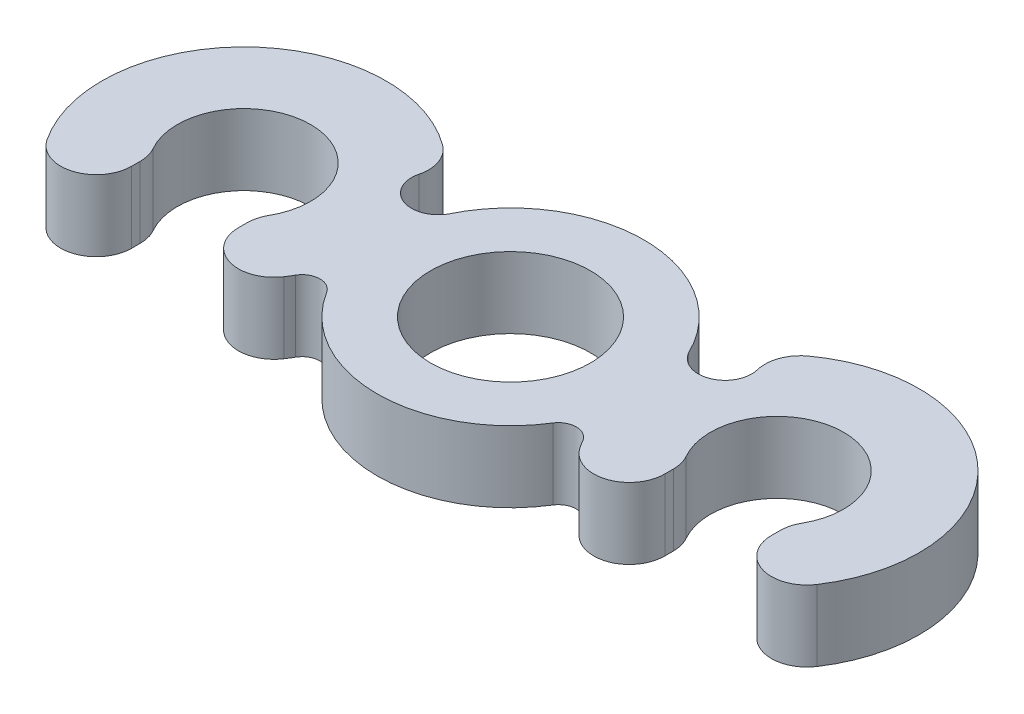
ISO-10303-21;
HEADER;
FILE_DESCRIPTION(('STEP AP214'),'2;1');
FILE_NAME('part.step','',(''),(''),'','','');
FILE_SCHEMA(('AUTOMOTIVE_DESIGN { 1 0 10303 214 1 1 1 1 }'));
ENDSEC;
DATA;
#1=APPLICATION_CONTEXT('core data for automotive mechanical design processes');
#2=APPLICATION_PROTOCOL_DEFINITION('international standard','automotive_design',2000,#1);
#3=PRODUCT_CONTEXT('',#1,'mechanical');
#4=PRODUCT('Part','Part','',(#3));
#5=PRODUCT_RELATED_PRODUCT_CATEGORY('part','',(#4));
#6=PRODUCT_DEFINITION_FORMATION('','',#4);
#7=PRODUCT_DEFINITION_CONTEXT('part definition',#1,'design');
#8=PRODUCT_DEFINITION('design','',#6,#7);
#9=PRODUCT_DEFINITION_SHAPE('','',#8);
#10=(LENGTH_UNIT() NAMED_UNIT(*) SI_UNIT(.MILLI.,.METRE.));
#11=(NAMED_UNIT(*) PLANE_ANGLE_UNIT() SI_UNIT($,.RADIAN.));
#12=(NAMED_UNIT(*) SI_UNIT($,.STERADIAN.) SOLID_ANGLE_UNIT());
#13=UNCERTAINTY_MEASURE_WITH_UNIT(LENGTH_MEASURE(1.E-05),#10,'distance_accuracy_value','');
#14=(GEOMETRIC_REPRESENTATION_CONTEXT(3) GLOBAL_UNCERTAINTY_ASSIGNED_CONTEXT((#13)) GLOBAL_UNIT_ASSIGNED_CONTEXT((#10,
#11,#12)) REPRESENTATION_CONTEXT('',''));
#15=CARTESIAN_POINT('',(0.,0.,0.));
#16=DIRECTION('',(0.,0.,1.));
#17=DIRECTION('',(1.,0.,0.));
#18=AXIS2_PLACEMENT_3D('',#15,#16,#17);
#19=CARTESIAN_POINT('',(-15.,2.,0.));
#20=DIRECTION('',(0.,-1.,0.));
#21=DIRECTION('',(0.,0.,-1.));
#22=AXIS2_PLACEMENT_3D('',#19,#20,#21);
#23=CYLINDRICAL_SURFACE('',#22,8.);
#24=CARTESIAN_POINT('',(-15.,-2.,0.));
#25=DIRECTION('',(0.,1.,0.));
#26=DIRECTION('',(0.,0.,1.));
#27=AXIS2_PLACEMENT_3D('',#24,#25,#26);
#28=CIRCLE('',#27,8.);
#29=CARTESIAN_POINT('',(-8.33333333333333,-2.,4.42216638714053));
#30=VERTEX_POINT('',#29);
#31=CARTESIAN_POINT('',(-8.0783809474824,-2.,4.01138251626859));
#32=VERTEX_POINT('',#31);
#33=EDGE_CURVE('E341',#30,#32,#28,.T.);
#34=ORIENTED_EDGE('',*,*,#33,.T.);
#35=DIRECTION('',(0.,-1.,0.));
#36=VECTOR('',#35,1.);
#37=CARTESIAN_POINT('',(-8.0783809474824,2.,4.01138251626859));
#38=LINE('',#37,#36);
#39=CARTESIAN_POINT('',(-8.0783809474824,2.,4.01138251626859));
#40=VERTEX_POINT('',#39);
#41=EDGE_CURVE('E413',#32,#40,#38,.F.);
#42=ORIENTED_EDGE('',*,*,#41,.T.);
#43=CARTESIAN_POINT('',(-15.,2.,0.));
#44=DIRECTION('',(0.,1.,0.));
#45=DIRECTION('',(0.,0.,1.));
#46=AXIS2_PLACEMENT_3D('',#43,#44,#45);
#47=CIRCLE('',#46,8.);
#48=CARTESIAN_POINT('',(-8.33333333333333,2.,4.42216638714053));
#49=VERTEX_POINT('',#48);
#50=EDGE_CURVE('E348',#49,#40,#47,.T.);
#51=ORIENTED_EDGE('',*,*,#50,.F.);
#52=DIRECTION('',(0.,-1.,0.));
#53=VECTOR('',#52,1.);
#54=CARTESIAN_POINT('',(-8.33333333333333,2.,4.42216638714053));
#55=LINE('',#54,#53);
#56=EDGE_CURVE('E385',#49,#30,#55,.T.);
#57=ORIENTED_EDGE('',*,*,#56,.T.);
#58=EDGE_LOOP('',(#34,#42,#51,#57));
#59=FACE_BOUND('',#58,.T.);
#60=ADVANCED_FACE('F35',(#59),#23,.T.);
#61=CARTESIAN_POINT('',(-15.,2.,0.));
#62=DIRECTION('',(0.,1.,0.));
#63=DIRECTION('',(0.,0.,1.));
#64=AXIS2_PLACEMENT_3D('',#61,#62,#63);
#65=PLANE('',#64);
#66=CARTESIAN_POINT('',(0.,2.,0.));
#67=DIRECTION('',(0.,1.,0.));
#68=DIRECTION('',(0.,0.,1.));
#69=AXIS2_PLACEMENT_3D('',#66,#67,#68);
#70=CIRCLE('',#69,4.5);
#71=CARTESIAN_POINT('',(0.,2.,4.5));
#72=VERTEX_POINT('',#71);
#73=EDGE_CURVE('E495',#72,#72,#70,.T.);
#74=ORIENTED_EDGE('',*,*,#73,.F.);
#75=EDGE_LOOP('',(#74));
#76=FACE_BOUND('',#75,.T.);
#77=ORIENTED_EDGE('',*,*,#50,.T.);
#78=CARTESIAN_POINT('',(-7.2131785659177,2.,4.51280533080217));
#79=DIRECTION('',(0.,1.,0.));
#80=DIRECTION('',(0.,0.,1.));
#81=AXIS2_PLACEMENT_3D('',#78,#79,#80);
#82=CIRCLE('',#81,1.);
#83=CARTESIAN_POINT('',(-6.3654216790065,2.,3.9824203190469));
#84=VERTEX_POINT('',#83);
#85=EDGE_CURVE('E43',#40,#84,#82,.F.);
#86=ORIENTED_EDGE('',*,*,#85,.T.);
#87=CARTESIAN_POINT('',(0.,2.,0.));
#88=DIRECTION('',(0.,1.,0.));
#89=DIRECTION('',(0.,0.,1.));
#90=AXIS2_PLACEMENT_3D('',#87,#88,#89);
#91=CIRCLE('',#90,7.50854611420371);
#92=CARTESIAN_POINT('',(6.3654216790065,2.,3.9824203190469));
#93=VERTEX_POINT('',#92);
#94=EDGE_CURVE('E423',#84,#93,#91,.T.);
#95=ORIENTED_EDGE('',*,*,#94,.T.);
#96=CARTESIAN_POINT('',(7.2131785659177,2.,4.51280533080217));
#97=DIRECTION('',(0.,1.,0.));
#98=DIRECTION('',(0.,0.,1.));
#99=AXIS2_PLACEMENT_3D('',#96,#97,#98);
#100=CIRCLE('',#99,1.);
#101=CARTESIAN_POINT('',(8.0783809474824,2.,4.01138251626859));
#102=VERTEX_POINT('',#101);
#103=EDGE_CURVE('E417',#93,#102,#100,.F.);
#104=ORIENTED_EDGE('',*,*,#103,.T.);
#105=CARTESIAN_POINT('',(15.,2.,0.));
#106=DIRECTION('',(0.,-1.,0.));
#107=DIRECTION('',(0.,0.,1.));
#108=AXIS2_PLACEMENT_3D('',#105,#106,#107);
#109=CIRCLE('',#108,8.);
#110=CARTESIAN_POINT('',(8.33333333333333,2.,4.42216638714053));
#111=VERTEX_POINT('',#110);
#112=EDGE_CURVE('E274',#111,#102,#109,.T.);
#113=ORIENTED_EDGE('',*,*,#112,.F.);
#114=CARTESIAN_POINT('',(10.,2.,3.3166247903554));
#115=DIRECTION('',(0.,-1.,0.));
#116=DIRECTION('',(0.,0.,1.));
#117=AXIS2_PLACEMENT_3D('',#114,#115,#116);
#118=CIRCLE('',#117,2.);
#119=CARTESIAN_POINT('',(12.,2.,3.3166247903554));
#120=VERTEX_POINT('',#119);
#121=EDGE_CURVE('E315',#120,#111,#118,.T.);
#122=ORIENTED_EDGE('',*,*,#121,.F.);
#123=DIRECTION('',(0.,0.,-1.));
#124=VECTOR('',#123,1.);
#125=CARTESIAN_POINT('',(12.,2.,0.));
#126=LINE('',#125,#124);
#127=CARTESIAN_POINT('',(12.,2.,2.83945417290014));
#128=VERTEX_POINT('',#127);
#129=EDGE_CURVE('E249',#120,#128,#126,.T.);
#130=ORIENTED_EDGE('',*,*,#129,.T.);
#131=CARTESIAN_POINT('',(10.,2.,2.83945417290014));
#132=DIRECTION('',(0.,-1.,0.));
#133=DIRECTION('',(0.,0.,1.));
#134=AXIS2_PLACEMENT_3D('',#131,#132,#133);
#135=CIRCLE('',#134,2.);
#136=CARTESIAN_POINT('',(11.7391304347826,2.,1.85181793884791));
#137=VERTEX_POINT('',#136);
#138=EDGE_CURVE('E281',#137,#128,#135,.T.);
#139=ORIENTED_EDGE('',*,*,#138,.F.);
#140=CARTESIAN_POINT('',(15.,2.,0.));
#141=DIRECTION('',(0.,-1.,0.));
#142=DIRECTION('',(0.,0.,1.));
#143=AXIS2_PLACEMENT_3D('',#140,#141,#142);
#144=CIRCLE('',#143,3.75);
#145=CARTESIAN_POINT('',(18.2608695652174,2.,1.85181793884791));
#146=VERTEX_POINT('',#145);
#147=EDGE_CURVE('E267',#137,#146,#144,.T.);
#148=ORIENTED_EDGE('',*,*,#147,.T.);
#149=CARTESIAN_POINT('',(20.,2.,2.83945417290013));
#150=DIRECTION('',(0.,-1.,0.));
#151=DIRECTION('',(0.,0.,1.));
#152=AXIS2_PLACEMENT_3D('',#149,#150,#151);
#153=CIRCLE('',#152,2.);
#154=CARTESIAN_POINT('',(18.,2.,2.83945417290013));
#155=VERTEX_POINT('',#154);
#156=EDGE_CURVE('E284',#155,#146,#153,.T.);
#157=ORIENTED_EDGE('',*,*,#156,.F.);
#158=DIRECTION('',(0.,0.,1.));
#159=VECTOR('',#158,1.);
#160=CARTESIAN_POINT('',(18.,2.,0.));
#161=LINE('',#160,#159);
#162=CARTESIAN_POINT('',(18.,2.,3.3166247903554));
#163=VERTEX_POINT('',#162);
#164=EDGE_CURVE('E227',#155,#163,#161,.T.);
#165=ORIENTED_EDGE('',*,*,#164,.T.);
#166=CARTESIAN_POINT('',(20.,2.,3.3166247903554));
#167=DIRECTION('',(0.,-1.,0.));
#168=DIRECTION('',(0.,0.,1.));
#169=AXIS2_PLACEMENT_3D('',#166,#167,#168);
#170=CIRCLE('',#169,2.);
#171=CARTESIAN_POINT('',(21.6666666666667,2.,4.42216638714053));
#172=VERTEX_POINT('',#171);
#173=EDGE_CURVE('E312',#172,#163,#170,.T.);
#174=ORIENTED_EDGE('',*,*,#173,.F.);
#175=CARTESIAN_POINT('',(10.2894826538785,2.,-6.466144626583));
#176=VERTEX_POINT('',#175);
#177=EDGE_CURVE('E232',#176,#172,#109,.T.);
#178=ORIENTED_EDGE('',*,*,#177,.F.);
#179=CARTESIAN_POINT('',(11.4671119904088,2.,-4.84960846993725));
#180=DIRECTION('',(0.,-1.,0.));
#181=DIRECTION('',(0.,0.,1.));
#182=AXIS2_PLACEMENT_3D('',#179,#180,#181);
#183=CIRCLE('',#182,2.);
#184=CARTESIAN_POINT('',(9.5269318643035,2.,-4.36411791568739));
#185=VERTEX_POINT('',#184);
#186=EDGE_CURVE('E231',#185,#176,#183,.T.);
#187=ORIENTED_EDGE('',*,*,#186,.F.);
#188=CARTESIAN_POINT('',(8.07179676972449,2.,-4.));
#189=DIRECTION('',(0.,-1.,0.));
#190=DIRECTION('',(0.,0.,1.));
#191=AXIS2_PLACEMENT_3D('',#188,#189,#190);
#192=CIRCLE('',#191,1.5);
#193=CARTESIAN_POINT('',(6.84081905975206,2.,-3.14285714285714));
#194=VERTEX_POINT('',#193);
#195=EDGE_CURVE('E252',#185,#194,#192,.T.);
#196=ORIENTED_EDGE('',*,*,#195,.T.);
#197=CARTESIAN_POINT('',(5.19951544645548,2.,-2.));
#198=DIRECTION('',(0.,-1.,0.));
#199=DIRECTION('',(0.,0.,1.));
#200=AXIS2_PLACEMENT_3D('',#197,#198,#199);
#201=CIRCLE('',#200,2.);
#202=CARTESIAN_POINT('',(6.78103889346888,2.,-3.22424817195977));
#203=VERTEX_POINT('',#202);
#204=EDGE_CURVE('E279',#203,#194,#201,.T.);
#205=ORIENTED_EDGE('',*,*,#204,.F.);
#206=CARTESIAN_POINT('',(-6.78103889346888,2.,-3.22424817195977));
#207=VERTEX_POINT('',#206);
#208=EDGE_CURVE('E430',#203,#207,#91,.T.);
#209=ORIENTED_EDGE('',*,*,#208,.T.);
#210=CARTESIAN_POINT('',(-5.19951544645548,2.,-2.));
#211=DIRECTION('',(0.,1.,0.));
#212=DIRECTION('',(0.,0.,1.));
#213=AXIS2_PLACEMENT_3D('',#210,#211,#212);
#214=CIRCLE('',#213,2.);
#215=CARTESIAN_POINT('',(-6.84081905975206,2.,-3.14285714285714));
#216=VERTEX_POINT('',#215);
#217=EDGE_CURVE('E356',#207,#216,#214,.T.);
#218=ORIENTED_EDGE('',*,*,#217,.T.);
#219=CARTESIAN_POINT('',(-8.07179676972449,2.,-4.));
#220=DIRECTION('',(0.,1.,0.));
#221=DIRECTION('',(0.,0.,1.));
#222=AXIS2_PLACEMENT_3D('',#219,#220,#221);
#223=CIRCLE('',#222,1.5);
#224=CARTESIAN_POINT('',(-9.5269318643035,2.,-4.36411791568739));
#225=VERTEX_POINT('',#224);
#226=EDGE_CURVE('E328',#225,#216,#223,.T.);
#227=ORIENTED_EDGE('',*,*,#226,.F.);
#228=CARTESIAN_POINT('',(-11.4671119904088,2.,-4.84960846993725));
#229=DIRECTION('',(0.,1.,0.));
#230=DIRECTION('',(0.,0.,1.));
#231=AXIS2_PLACEMENT_3D('',#228,#229,#230);
#232=CIRCLE('',#231,2.);
#233=CARTESIAN_POINT('',(-10.2894826538785,2.,-6.466144626583));
#234=VERTEX_POINT('',#233);
#235=EDGE_CURVE('E354',#225,#234,#232,.T.);
#236=ORIENTED_EDGE('',*,*,#235,.T.);
#237=CARTESIAN_POINT('',(-21.6666666666667,2.,4.42216638714053));
#238=VERTEX_POINT('',#237);
#239=EDGE_CURVE('E344',#234,#238,#47,.T.);
#240=ORIENTED_EDGE('',*,*,#239,.T.);
#241=CARTESIAN_POINT('',(-20.,2.,3.3166247903554));
#242=DIRECTION('',(0.,1.,0.));
#243=DIRECTION('',(0.,0.,1.));
#244=AXIS2_PLACEMENT_3D('',#241,#242,#243);
#245=CIRCLE('',#244,2.);
#246=CARTESIAN_POINT('',(-18.,2.,3.3166247903554));
#247=VERTEX_POINT('',#246);
#248=EDGE_CURVE('E394',#238,#247,#245,.T.);
#249=ORIENTED_EDGE('',*,*,#248,.T.);
#250=DIRECTION('',(0.,0.,1.));
#251=VECTOR('',#250,1.);
#252=CARTESIAN_POINT('',(-18.,2.,0.));
#253=LINE('',#252,#251);
#254=CARTESIAN_POINT('',(-18.,2.,2.83945417290013));
#255=VERTEX_POINT('',#254);
#256=EDGE_CURVE('E321',#255,#247,#253,.T.);
#257=ORIENTED_EDGE('',*,*,#256,.F.);
#258=CARTESIAN_POINT('',(-20.,2.,2.83945417290013));
#259=DIRECTION('',(0.,1.,0.));
#260=DIRECTION('',(0.,0.,1.));
#261=AXIS2_PLACEMENT_3D('',#258,#259,#260);
#262=CIRCLE('',#261,2.);
#263=CARTESIAN_POINT('',(-18.2608695652174,2.,1.85181793884791));
#264=VERTEX_POINT('',#263);
#265=EDGE_CURVE('E361',#255,#264,#262,.T.);
#266=ORIENTED_EDGE('',*,*,#265,.T.);
#267=CARTESIAN_POINT('',(-15.,2.,0.));
#268=DIRECTION('',(0.,1.,0.));
#269=DIRECTION('',(0.,0.,1.));
#270=AXIS2_PLACEMENT_3D('',#267,#268,#269);
#271=CIRCLE('',#270,3.75);
#272=CARTESIAN_POINT('',(-11.7391304347826,2.,1.85181793884791));
#273=VERTEX_POINT('',#272);
#274=EDGE_CURVE('E338',#273,#264,#271,.T.);
#275=ORIENTED_EDGE('',*,*,#274,.F.);
#276=CARTESIAN_POINT('',(-10.,2.,2.83945417290014));
#277=DIRECTION('',(0.,1.,0.));
#278=DIRECTION('',(0.,0.,1.));
#279=AXIS2_PLACEMENT_3D('',#276,#277,#278);
#280=CIRCLE('',#279,2.);
#281=CARTESIAN_POINT('',(-12.,2.,2.83945417290014));
#282=VERTEX_POINT('',#281);
#283=EDGE_CURVE('E358',#273,#282,#280,.T.);
#284=ORIENTED_EDGE('',*,*,#283,.T.);
#285=DIRECTION('',(0.,0.,-1.));
#286=VECTOR('',#285,1.);
#287=CARTESIAN_POINT('',(-12.,2.,0.));
#288=LINE('',#287,#286);
#289=CARTESIAN_POINT('',(-12.,2.,3.3166247903554));
#290=VERTEX_POINT('',#289);
#291=EDGE_CURVE('E326',#290,#282,#288,.T.);
#292=ORIENTED_EDGE('',*,*,#291,.F.);
#293=CARTESIAN_POINT('',(-10.,2.,3.3166247903554));
#294=DIRECTION('',(0.,1.,0.));
#295=DIRECTION('',(0.,0.,1.));
#296=AXIS2_PLACEMENT_3D('',#293,#294,#295);
#297=CIRCLE('',#296,2.);
#298=EDGE_CURVE('E396',#290,#49,#297,.T.);
#299=ORIENTED_EDGE('',*,*,#298,.T.);
#300=EDGE_LOOP('',(#77,#86,#95,#104,#113,#122,#130,#139,#148,#157,#165,#174,#178,#187,#196,#205,
#209,#218,#227,#236,#240,#249,#257,#266,#275,#284,#292,#299));
#301=FACE_BOUND('',#300,.T.);
#302=ADVANCED_FACE('F422',(#76,#301),#65,.T.);
#303=CARTESIAN_POINT('',(-15.,-2.,0.));
#304=DIRECTION('',(0.,1.,0.));
#305=DIRECTION('',(0.,0.,1.));
#306=AXIS2_PLACEMENT_3D('',#303,#304,#305);
#307=PLANE('',#306);
#308=CARTESIAN_POINT('',(0.,-2.,0.));
#309=DIRECTION('',(0.,1.,0.));
#310=DIRECTION('',(0.,0.,1.));
#311=AXIS2_PLACEMENT_3D('',#308,#309,#310);
#312=CIRCLE('',#311,4.5);
#313=CARTESIAN_POINT('',(0.,-2.,4.5));
#314=VERTEX_POINT('',#313);
#315=EDGE_CURVE('E431',#314,#314,#312,.T.);
#316=ORIENTED_EDGE('',*,*,#315,.T.);
#317=EDGE_LOOP('',(#316));
#318=FACE_BOUND('',#317,.T.);
#319=CARTESIAN_POINT('',(-5.19951544645548,-2.,-2.));
#320=DIRECTION('',(0.,1.,0.));
#321=DIRECTION('',(0.,0.,1.));
#322=AXIS2_PLACEMENT_3D('',#319,#320,#321);
#323=CIRCLE('',#322,2.);
#324=CARTESIAN_POINT('',(-6.84081905975206,-2.,-3.14285714285714));
#325=VERTEX_POINT('',#324);
#326=CARTESIAN_POINT('',(-6.78103889346888,-2.,-3.22424817195977));
#327=VERTEX_POINT('',#326);
#328=EDGE_CURVE('E369',#325,#327,#323,.F.);
#329=ORIENTED_EDGE('',*,*,#328,.T.);
#330=CARTESIAN_POINT('',(0.,-2.,0.));
#331=DIRECTION('',(0.,1.,0.));
#332=DIRECTION('',(0.,0.,1.));
#333=AXIS2_PLACEMENT_3D('',#330,#331,#332);
#334=CIRCLE('',#333,7.50854611420371);
#335=CARTESIAN_POINT('',(6.78103889346888,-2.,-3.22424817195977));
#336=VERTEX_POINT('',#335);
#337=EDGE_CURVE('E488',#327,#336,#334,.F.);
#338=ORIENTED_EDGE('',*,*,#337,.T.);
#339=CARTESIAN_POINT('',(5.19951544645548,-2.,-2.));
#340=DIRECTION('',(0.,-1.,0.));
#341=DIRECTION('',(0.,0.,1.));
#342=AXIS2_PLACEMENT_3D('',#339,#340,#341);
#343=CIRCLE('',#342,2.);
#344=CARTESIAN_POINT('',(6.84081905975206,-2.,-3.14285714285714));
#345=VERTEX_POINT('',#344);
#346=EDGE_CURVE('E292',#345,#336,#343,.F.);
#347=ORIENTED_EDGE('',*,*,#346,.F.);
#348=CARTESIAN_POINT('',(8.07179676972449,-2.,-4.));
#349=DIRECTION('',(0.,-1.,0.));
#350=DIRECTION('',(0.,0.,1.));
#351=AXIS2_PLACEMENT_3D('',#348,#349,#350);
#352=CIRCLE('',#351,1.5);
#353=CARTESIAN_POINT('',(9.5269318643035,-2.,-4.36411791568739));
#354=VERTEX_POINT('',#353);
#355=EDGE_CURVE('E261',#354,#345,#352,.T.);
#356=ORIENTED_EDGE('',*,*,#355,.F.);
#357=CARTESIAN_POINT('',(11.4671119904088,-2.,-4.84960846993725));
#358=DIRECTION('',(0.,-1.,0.));
#359=DIRECTION('',(0.,0.,1.));
#360=AXIS2_PLACEMENT_3D('',#357,#358,#359);
#361=CIRCLE('',#360,2.);
#362=CARTESIAN_POINT('',(10.2894826538785,-2.,-6.466144626583));
#363=VERTEX_POINT('',#362);
#364=EDGE_CURVE('E289',#363,#354,#361,.F.);
#365=ORIENTED_EDGE('',*,*,#364,.F.);
#366=CARTESIAN_POINT('',(15.,-2.,0.));
#367=DIRECTION('',(0.,-1.,0.));
#368=DIRECTION('',(0.,0.,1.));
#369=AXIS2_PLACEMENT_3D('',#366,#367,#368);
#370=CIRCLE('',#369,8.);
#371=CARTESIAN_POINT('',(21.6666666666667,-2.,4.42216638714053));
#372=VERTEX_POINT('',#371);
#373=EDGE_CURVE('E275',#363,#372,#370,.T.);
#374=ORIENTED_EDGE('',*,*,#373,.T.);
#375=CARTESIAN_POINT('',(20.,-2.,3.3166247903554));
#376=DIRECTION('',(0.,-1.,0.));
#377=DIRECTION('',(0.,0.,1.));
#378=AXIS2_PLACEMENT_3D('',#375,#376,#377);
#379=CIRCLE('',#378,2.);
#380=CARTESIAN_POINT('',(18.,-2.,3.3166247903554));
#381=VERTEX_POINT('',#380);
#382=EDGE_CURVE('E247',#381,#372,#379,.F.);
#383=ORIENTED_EDGE('',*,*,#382,.F.);
#384=DIRECTION('',(0.,0.,1.));
#385=VECTOR('',#384,1.);
#386=CARTESIAN_POINT('',(18.,-2.,0.));
#387=LINE('',#386,#385);
#388=CARTESIAN_POINT('',(18.,-2.,2.83945417290013));
#389=VERTEX_POINT('',#388);
#390=EDGE_CURVE('E224',#389,#381,#387,.T.);
#391=ORIENTED_EDGE('',*,*,#390,.F.);
#392=CARTESIAN_POINT('',(20.,-2.,2.83945417290013));
#393=DIRECTION('',(0.,-1.,0.));
#394=DIRECTION('',(0.,0.,1.));
#395=AXIS2_PLACEMENT_3D('',#392,#393,#394);
#396=CIRCLE('',#395,2.);
#397=CARTESIAN_POINT('',(18.2608695652174,-2.,1.85181793884791));
#398=VERTEX_POINT('',#397);
#399=EDGE_CURVE('E235',#398,#389,#396,.F.);
#400=ORIENTED_EDGE('',*,*,#399,.F.);
#401=CARTESIAN_POINT('',(15.,-2.,0.));
#402=DIRECTION('',(0.,-1.,0.));
#403=DIRECTION('',(0.,0.,1.));
#404=AXIS2_PLACEMENT_3D('',#401,#402,#403);
#405=CIRCLE('',#404,3.75);
#406=CARTESIAN_POINT('',(11.7391304347826,-2.,1.85181793884791));
#407=VERTEX_POINT('',#406);
#408=EDGE_CURVE('E264',#407,#398,#405,.T.);
#409=ORIENTED_EDGE('',*,*,#408,.F.);
#410=CARTESIAN_POINT('',(10.,-2.,2.83945417290014));
#411=DIRECTION('',(0.,-1.,0.));
#412=DIRECTION('',(0.,0.,1.));
#413=AXIS2_PLACEMENT_3D('',#410,#411,#412);
#414=CIRCLE('',#413,2.);
#415=CARTESIAN_POINT('',(12.,-2.,2.83945417290014));
#416=VERTEX_POINT('',#415);
#417=EDGE_CURVE('E241',#416,#407,#414,.F.);
#418=ORIENTED_EDGE('',*,*,#417,.F.);
#419=DIRECTION('',(0.,0.,-1.));
#420=VECTOR('',#419,1.);
#421=CARTESIAN_POINT('',(12.,-2.,0.));
#422=LINE('',#421,#420);
#423=CARTESIAN_POINT('',(12.,-2.,3.3166247903554));
#424=VERTEX_POINT('',#423);
#425=EDGE_CURVE('E248',#424,#416,#422,.T.);
#426=ORIENTED_EDGE('',*,*,#425,.F.);
#427=CARTESIAN_POINT('',(10.,-2.,3.3166247903554));
#428=DIRECTION('',(0.,-1.,0.));
#429=DIRECTION('',(0.,0.,1.));
#430=AXIS2_PLACEMENT_3D('',#427,#428,#429);
#431=CIRCLE('',#430,2.);
#432=CARTESIAN_POINT('',(8.33333333333333,-2.,4.42216638714053));
#433=VERTEX_POINT('',#432);
#434=EDGE_CURVE('E307',#433,#424,#431,.F.);
#435=ORIENTED_EDGE('',*,*,#434,.F.);
#436=CARTESIAN_POINT('',(8.0783809474824,-2.,4.01138251626859));
#437=VERTEX_POINT('',#436);
#438=EDGE_CURVE('E270',#433,#437,#370,.T.);
#439=ORIENTED_EDGE('',*,*,#438,.T.);
#440=CARTESIAN_POINT('',(7.2131785659177,-2.,4.51280533080217));
#441=DIRECTION('',(0.,1.,0.));
#442=DIRECTION('',(0.,0.,1.));
#443=AXIS2_PLACEMENT_3D('',#440,#441,#442);
#444=CIRCLE('',#443,1.);
#445=CARTESIAN_POINT('',(6.3654216790065,-2.,3.9824203190469));
#446=VERTEX_POINT('',#445);
#447=EDGE_CURVE('E415',#437,#446,#444,.T.);
#448=ORIENTED_EDGE('',*,*,#447,.T.);
#449=CARTESIAN_POINT('',(-6.3654216790065,-2.,3.9824203190469));
#450=VERTEX_POINT('',#449);
#451=EDGE_CURVE('E493',#446,#450,#334,.F.);
#452=ORIENTED_EDGE('',*,*,#451,.T.);
#453=CARTESIAN_POINT('',(-7.2131785659177,-2.,4.51280533080217));
#454=DIRECTION('',(0.,1.,0.));
#455=DIRECTION('',(0.,0.,1.));
#456=AXIS2_PLACEMENT_3D('',#453,#454,#455);
#457=CIRCLE('',#456,1.);
#458=EDGE_CURVE('E11',#450,#32,#457,.T.);
#459=ORIENTED_EDGE('',*,*,#458,.T.);
#460=ORIENTED_EDGE('',*,*,#33,.F.);
#461=CARTESIAN_POINT('',(-10.,-2.,3.3166247903554));
#462=DIRECTION('',(0.,1.,0.));
#463=DIRECTION('',(0.,0.,1.));
#464=AXIS2_PLACEMENT_3D('',#461,#462,#463);
#465=CIRCLE('',#464,2.);
#466=CARTESIAN_POINT('',(-12.,-2.,3.3166247903554));
#467=VERTEX_POINT('',#466);
#468=EDGE_CURVE('E390',#30,#467,#465,.F.);
#469=ORIENTED_EDGE('',*,*,#468,.T.);
#470=DIRECTION('',(0.,0.,-1.));
#471=VECTOR('',#470,1.);
#472=CARTESIAN_POINT('',(-12.,-2.,0.));
#473=LINE('',#472,#471);
#474=CARTESIAN_POINT('',(-12.,-2.,2.83945417290014));
#475=VERTEX_POINT('',#474);
#476=EDGE_CURVE('E325',#467,#475,#473,.T.);
#477=ORIENTED_EDGE('',*,*,#476,.T.);
#478=CARTESIAN_POINT('',(-10.,-2.,2.83945417290014));
#479=DIRECTION('',(0.,1.,0.));
#480=DIRECTION('',(0.,0.,1.));
#481=AXIS2_PLACEMENT_3D('',#478,#479,#480);
#482=CIRCLE('',#481,2.);
#483=CARTESIAN_POINT('',(-11.7391304347826,-2.,1.85181793884791));
#484=VERTEX_POINT('',#483);
#485=EDGE_CURVE('E371',#475,#484,#482,.F.);
#486=ORIENTED_EDGE('',*,*,#485,.T.);
#487=CARTESIAN_POINT('',(-15.,-2.,0.));
#488=DIRECTION('',(0.,1.,0.));
#489=DIRECTION('',(0.,0.,1.));
#490=AXIS2_PLACEMENT_3D('',#487,#488,#489);
#491=CIRCLE('',#490,3.75);
#492=CARTESIAN_POINT('',(-18.2608695652174,-2.,1.85181793884791));
#493=VERTEX_POINT('',#492);
#494=EDGE_CURVE('E335',#484,#493,#491,.T.);
#495=ORIENTED_EDGE('',*,*,#494,.T.);
#496=CARTESIAN_POINT('',(-20.,-2.,2.83945417290013));
#497=DIRECTION('',(0.,1.,0.));
#498=DIRECTION('',(0.,0.,1.));
#499=AXIS2_PLACEMENT_3D('',#496,#497,#498);
#500=CIRCLE('',#499,2.);
#501=CARTESIAN_POINT('',(-18.,-2.,2.83945417290013));
#502=VERTEX_POINT('',#501);
#503=EDGE_CURVE('E373',#493,#502,#500,.F.);
#504=ORIENTED_EDGE('',*,*,#503,.T.);
#505=DIRECTION('',(0.,0.,1.));
#506=VECTOR('',#505,1.);
#507=CARTESIAN_POINT('',(-18.,-2.,0.));
#508=LINE('',#507,#506);
#509=CARTESIAN_POINT('',(-18.,-2.,3.3166247903554));
#510=VERTEX_POINT('',#509);
#511=EDGE_CURVE('E322',#502,#510,#508,.T.);
#512=ORIENTED_EDGE('',*,*,#511,.T.);
#513=CARTESIAN_POINT('',(-20.,-2.,3.3166247903554));
#514=DIRECTION('',(0.,1.,0.));
#515=DIRECTION('',(0.,0.,1.));
#516=AXIS2_PLACEMENT_3D('',#513,#514,#515);
#517=CIRCLE('',#516,2.);
#518=CARTESIAN_POINT('',(-21.6666666666667,-2.,4.42216638714053));
#519=VERTEX_POINT('',#518);
#520=EDGE_CURVE('E388',#510,#519,#517,.F.);
#521=ORIENTED_EDGE('',*,*,#520,.T.);
#522=CARTESIAN_POINT('',(-10.2894826538785,-2.,-6.466144626583));
#523=VERTEX_POINT('',#522);
#524=EDGE_CURVE('E349',#523,#519,#28,.T.);
#525=ORIENTED_EDGE('',*,*,#524,.F.);
#526=CARTESIAN_POINT('',(-11.4671119904088,-2.,-4.84960846993725));
#527=DIRECTION('',(0.,1.,0.));
#528=DIRECTION('',(0.,0.,1.));
#529=AXIS2_PLACEMENT_3D('',#526,#527,#528);
#530=CIRCLE('',#529,2.);
#531=CARTESIAN_POINT('',(-9.5269318643035,-2.,-4.36411791568739));
#532=VERTEX_POINT('',#531);
#533=EDGE_CURVE('E367',#523,#532,#530,.F.);
#534=ORIENTED_EDGE('',*,*,#533,.T.);
#535=CARTESIAN_POINT('',(-8.07179676972449,-2.,-4.));
#536=DIRECTION('',(0.,1.,0.));
#537=DIRECTION('',(0.,0.,1.));
#538=AXIS2_PLACEMENT_3D('',#535,#536,#537);
#539=CIRCLE('',#538,1.5);
#540=EDGE_CURVE('E332',#532,#325,#539,.T.);
#541=ORIENTED_EDGE('',*,*,#540,.T.);
#542=EDGE_LOOP('',(#329,#338,#347,#356,#365,#374,#383,#391,#400,#409,#418,#426,#435,#439,#448,
#452,#459,#460,#469,#477,#486,#495,#504,#512,#521,#525,#534,#541));
#543=FACE_BOUND('',#542,.T.);
#544=ADVANCED_FACE('F244',(#318,#543),#307,.F.);
#545=ORIENTED_EDGE('',*,*,#524,.T.);
#546=DIRECTION('',(0.,-1.,0.));
#547=VECTOR('',#546,1.);
#548=CARTESIAN_POINT('',(-21.6666666666667,2.,4.42216638714053));
#549=LINE('',#548,#547);
#550=EDGE_CURVE('E398',#519,#238,#549,.F.);
#551=ORIENTED_EDGE('',*,*,#550,.T.);
#552=ORIENTED_EDGE('',*,*,#239,.F.);
#553=DIRECTION('',(0.,-1.,0.));
#554=VECTOR('',#553,1.);
#555=CARTESIAN_POINT('',(-10.2894826538785,2.,-6.466144626583));
#556=LINE('',#555,#554);
#557=EDGE_CURVE('E382',#234,#523,#556,.T.);
#558=ORIENTED_EDGE('',*,*,#557,.T.);
#559=EDGE_LOOP('',(#545,#551,#552,#558));
#560=FACE_BOUND('',#559,.T.);
#561=ADVANCED_FACE('F469',(#560),#23,.T.);
#562=CARTESIAN_POINT('',(-15.,2.,0.));
#563=DIRECTION('',(0.,-1.,0.));
#564=DIRECTION('',(0.,0.,-1.));
#565=AXIS2_PLACEMENT_3D('',#562,#563,#564);
#566=CYLINDRICAL_SURFACE('',#565,3.75);
#567=ORIENTED_EDGE('',*,*,#274,.T.);
#568=DIRECTION('',(0.,-1.,0.));
#569=VECTOR('',#568,1.);
#570=CARTESIAN_POINT('',(-18.2608695652174,2.,1.85181793884791));
#571=LINE('',#570,#569);
#572=EDGE_CURVE('E365',#264,#493,#571,.T.);
#573=ORIENTED_EDGE('',*,*,#572,.T.);
#574=ORIENTED_EDGE('',*,*,#494,.F.);
#575=DIRECTION('',(0.,-1.,0.));
#576=VECTOR('',#575,1.);
#577=CARTESIAN_POINT('',(-11.7391304347826,2.,1.85181793884791));
#578=LINE('',#577,#576);
#579=EDGE_CURVE('E363',#484,#273,#578,.F.);
#580=ORIENTED_EDGE('',*,*,#579,.T.);
#581=EDGE_LOOP('',(#567,#573,#574,#580));
#582=FACE_BOUND('',#581,.T.);
#583=ADVANCED_FACE('F453',(#582),#566,.F.);
#584=CARTESIAN_POINT('',(-8.07179676972449,-2.,-4.));
#585=DIRECTION('',(0.,1.,0.));
#586=DIRECTION('',(0.,0.,1.));
#587=AXIS2_PLACEMENT_3D('',#584,#585,#586);
#588=CYLINDRICAL_SURFACE('',#587,1.5);
#589=ORIENTED_EDGE('',*,*,#226,.T.);
#590=DIRECTION('',(0.,1.,0.));
#591=VECTOR('',#590,1.);
#592=CARTESIAN_POINT('',(-6.84081905975206,-2.,-3.14285714285714));
#593=LINE('',#592,#591);
#594=EDGE_CURVE('E380',#216,#325,#593,.F.);
#595=ORIENTED_EDGE('',*,*,#594,.T.);
#596=ORIENTED_EDGE('',*,*,#540,.F.);
#597=DIRECTION('',(0.,1.,0.));
#598=VECTOR('',#597,1.);
#599=CARTESIAN_POINT('',(-9.5269318643035,-2.,-4.36411791568739));
#600=LINE('',#599,#598);
#601=EDGE_CURVE('E378',#532,#225,#600,.T.);
#602=ORIENTED_EDGE('',*,*,#601,.T.);
#603=EDGE_LOOP('',(#589,#595,#596,#602));
#604=FACE_BOUND('',#603,.T.);
#605=ADVANCED_FACE('F479',(#604),#588,.F.);
#606=CARTESIAN_POINT('',(-18.,-2.,0.));
#607=DIRECTION('',(-1.,0.,0.));
#608=DIRECTION('',(0.,0.,1.));
#609=AXIS2_PLACEMENT_3D('',#606,#607,#608);
#610=PLANE('',#609);
#611=ORIENTED_EDGE('',*,*,#256,.T.);
#612=DIRECTION('',(0.,-1.,0.));
#613=VECTOR('',#612,1.);
#614=CARTESIAN_POINT('',(-18.,-2.,3.3166247903554));
#615=LINE('',#614,#613);
#616=EDGE_CURVE('E401',#247,#510,#615,.T.);
#617=ORIENTED_EDGE('',*,*,#616,.T.);
#618=ORIENTED_EDGE('',*,*,#511,.F.);
#619=DIRECTION('',(0.,1.,0.));
#620=VECTOR('',#619,1.);
#621=CARTESIAN_POINT('',(-18.,2.,2.83945417290013));
#622=LINE('',#621,#620);
#623=EDGE_CURVE('E347',#502,#255,#622,.T.);
#624=ORIENTED_EDGE('',*,*,#623,.T.);
#625=EDGE_LOOP('',(#611,#617,#618,#624));
#626=FACE_BOUND('',#625,.T.);
#627=ADVANCED_FACE('F461',(#626),#610,.F.);
#628=CARTESIAN_POINT('',(-12.,-2.,0.));
#629=DIRECTION('',(1.,0.,0.));
#630=DIRECTION('',(0.,0.,-1.));
#631=AXIS2_PLACEMENT_3D('',#628,#629,#630);
#632=PLANE('',#631);
#633=ORIENTED_EDGE('',*,*,#476,.F.);
#634=DIRECTION('',(0.,-1.,0.));
#635=VECTOR('',#634,1.);
#636=CARTESIAN_POINT('',(-12.,-2.,3.3166247903554));
#637=LINE('',#636,#635);
#638=EDGE_CURVE('E392',#467,#290,#637,.F.);
#639=ORIENTED_EDGE('',*,*,#638,.T.);
#640=ORIENTED_EDGE('',*,*,#291,.T.);
#641=DIRECTION('',(0.,1.,0.));
#642=VECTOR('',#641,1.);
#643=CARTESIAN_POINT('',(-12.,-2.,2.83945417290014));
#644=LINE('',#643,#642);
#645=EDGE_CURVE('E375',#282,#475,#644,.F.);
#646=ORIENTED_EDGE('',*,*,#645,.T.);
#647=EDGE_LOOP('',(#633,#639,#640,#646));
#648=FACE_BOUND('',#647,.T.);
#649=ADVANCED_FACE('F440',(#648),#632,.F.);
#650=CARTESIAN_POINT('',(-20.,2.,2.83945417290013));
#651=DIRECTION('',(0.,-1.,0.));
#652=DIRECTION('',(0.,0.,-1.));
#653=AXIS2_PLACEMENT_3D('',#650,#651,#652);
#654=CYLINDRICAL_SURFACE('',#653,2.);
#655=ORIENTED_EDGE('',*,*,#503,.F.);
#656=ORIENTED_EDGE('',*,*,#572,.F.);
#657=ORIENTED_EDGE('',*,*,#265,.F.);
#658=ORIENTED_EDGE('',*,*,#623,.F.);
#659=EDGE_LOOP('',(#655,#656,#657,#658));
#660=FACE_BOUND('',#659,.T.);
#661=ADVANCED_FACE('F456',(#660),#654,.T.);
#662=CARTESIAN_POINT('',(-10.,2.,2.83945417290014));
#663=DIRECTION('',(0.,-1.,0.));
#664=DIRECTION('',(0.,0.,-1.));
#665=AXIS2_PLACEMENT_3D('',#662,#663,#664);
#666=CYLINDRICAL_SURFACE('',#665,2.);
#667=ORIENTED_EDGE('',*,*,#283,.F.);
#668=ORIENTED_EDGE('',*,*,#579,.F.);
#669=ORIENTED_EDGE('',*,*,#485,.F.);
#670=ORIENTED_EDGE('',*,*,#645,.F.);
#671=EDGE_LOOP('',(#667,#668,#669,#670));
#672=FACE_BOUND('',#671,.T.);
#673=ADVANCED_FACE('F449',(#672),#666,.T.);
#674=CARTESIAN_POINT('',(-5.19951544645548,-2.,-2.));
#675=DIRECTION('',(0.,1.,0.));
#676=DIRECTION('',(0.,0.,1.));
#677=AXIS2_PLACEMENT_3D('',#674,#675,#676);
#678=CYLINDRICAL_SURFACE('',#677,2.);
#679=DIRECTION('',(0.,1.,0.));
#680=VECTOR('',#679,1.);
#681=CARTESIAN_POINT('',(-6.78103889346888,0.,-3.22424817195977));
#682=LINE('',#681,#680);
#683=EDGE_CURVE('E257',#327,#207,#682,.T.);
#684=ORIENTED_EDGE('',*,*,#683,.F.);
#685=ORIENTED_EDGE('',*,*,#328,.F.);
#686=ORIENTED_EDGE('',*,*,#594,.F.);
#687=ORIENTED_EDGE('',*,*,#217,.F.);
#688=EDGE_LOOP('',(#684,#685,#686,#687));
#689=FACE_BOUND('',#688,.T.);
#690=ADVANCED_FACE('F483',(#689),#678,.T.);
#691=CARTESIAN_POINT('',(-11.4671119904088,-2.,-4.84960846993725));
#692=DIRECTION('',(0.,1.,0.));
#693=DIRECTION('',(0.,0.,1.));
#694=AXIS2_PLACEMENT_3D('',#691,#692,#693);
#695=CYLINDRICAL_SURFACE('',#694,2.);
#696=ORIENTED_EDGE('',*,*,#235,.F.);
#697=ORIENTED_EDGE('',*,*,#601,.F.);
#698=ORIENTED_EDGE('',*,*,#533,.F.);
#699=ORIENTED_EDGE('',*,*,#557,.F.);
#700=EDGE_LOOP('',(#696,#697,#698,#699));
#701=FACE_BOUND('',#700,.T.);
#702=ADVANCED_FACE('F474',(#701),#695,.T.);
#703=CARTESIAN_POINT('',(-10.,2.,3.3166247903554));
#704=DIRECTION('',(0.,-1.,0.));
#705=DIRECTION('',(0.,0.,-1.));
#706=AXIS2_PLACEMENT_3D('',#703,#704,#705);
#707=CYLINDRICAL_SURFACE('',#706,2.);
#708=ORIENTED_EDGE('',*,*,#298,.F.);
#709=ORIENTED_EDGE('',*,*,#638,.F.);
#710=ORIENTED_EDGE('',*,*,#468,.F.);
#711=ORIENTED_EDGE('',*,*,#56,.F.);
#712=EDGE_LOOP('',(#708,#709,#710,#711));
#713=FACE_BOUND('',#712,.T.);
#714=ADVANCED_FACE('F444',(#713),#707,.T.);
#715=CARTESIAN_POINT('',(-20.,2.,3.3166247903554));
#716=DIRECTION('',(0.,-1.,0.));
#717=DIRECTION('',(0.,0.,-1.));
#718=AXIS2_PLACEMENT_3D('',#715,#716,#717);
#719=CYLINDRICAL_SURFACE('',#718,2.);
#720=ORIENTED_EDGE('',*,*,#520,.F.);
#721=ORIENTED_EDGE('',*,*,#616,.F.);
#722=ORIENTED_EDGE('',*,*,#248,.F.);
#723=ORIENTED_EDGE('',*,*,#550,.F.);
#724=EDGE_LOOP('',(#720,#721,#722,#723));
#725=FACE_BOUND('',#724,.T.);
#726=ADVANCED_FACE('F465',(#725),#719,.T.);
#727=CARTESIAN_POINT('',(15.,2.,0.));
#728=DIRECTION('',(0.,-1.,0.));
#729=DIRECTION('',(0.,0.,-1.));
#730=AXIS2_PLACEMENT_3D('',#727,#728,#729);
#731=CYLINDRICAL_SURFACE('',#730,8.);
#732=ORIENTED_EDGE('',*,*,#112,.T.);
#733=DIRECTION('',(0.,-1.,0.));
#734=VECTOR('',#733,1.);
#735=CARTESIAN_POINT('',(8.0783809474824,2.,4.01138251626859));
#736=LINE('',#735,#734);
#737=EDGE_CURVE('E406',#102,#437,#736,.T.);
#738=ORIENTED_EDGE('',*,*,#737,.T.);
#739=ORIENTED_EDGE('',*,*,#438,.F.);
#740=DIRECTION('',(0.,-1.,0.));
#741=VECTOR('',#740,1.);
#742=CARTESIAN_POINT('',(8.33333333333333,2.,4.42216638714053));
#743=LINE('',#742,#741);
#744=EDGE_CURVE('E303',#111,#433,#743,.T.);
#745=ORIENTED_EDGE('',*,*,#744,.F.);
#746=EDGE_LOOP('',(#732,#738,#739,#745));
#747=FACE_BOUND('',#746,.T.);
#748=ADVANCED_FACE('F532',(#747),#731,.T.);
#749=ORIENTED_EDGE('',*,*,#373,.F.);
#750=DIRECTION('',(0.,-1.,0.));
#751=VECTOR('',#750,1.);
#752=CARTESIAN_POINT('',(10.2894826538785,2.,-6.466144626583));
#753=LINE('',#752,#751);
#754=EDGE_CURVE('E301',#176,#363,#753,.T.);
#755=ORIENTED_EDGE('',*,*,#754,.F.);
#756=ORIENTED_EDGE('',*,*,#177,.T.);
#757=DIRECTION('',(0.,-1.,0.));
#758=VECTOR('',#757,1.);
#759=CARTESIAN_POINT('',(21.6666666666667,2.,4.42216638714053));
#760=LINE('',#759,#758);
#761=EDGE_CURVE('E317',#372,#172,#760,.F.);
#762=ORIENTED_EDGE('',*,*,#761,.F.);
#763=EDGE_LOOP('',(#749,#755,#756,#762));
#764=FACE_BOUND('',#763,.T.);
#765=ADVANCED_FACE('F561',(#764),#731,.T.);
#766=CARTESIAN_POINT('',(15.,2.,0.));
#767=DIRECTION('',(0.,-1.,0.));
#768=DIRECTION('',(0.,0.,-1.));
#769=AXIS2_PLACEMENT_3D('',#766,#767,#768);
#770=CYLINDRICAL_SURFACE('',#769,3.75);
#771=ORIENTED_EDGE('',*,*,#147,.F.);
#772=DIRECTION('',(0.,-1.,0.));
#773=VECTOR('',#772,1.);
#774=CARTESIAN_POINT('',(11.7391304347826,2.,1.85181793884791));
#775=LINE('',#774,#773);
#776=EDGE_CURVE('E286',#407,#137,#775,.F.);
#777=ORIENTED_EDGE('',*,*,#776,.F.);
#778=ORIENTED_EDGE('',*,*,#408,.T.);
#779=DIRECTION('',(0.,-1.,0.));
#780=VECTOR('',#779,1.);
#781=CARTESIAN_POINT('',(18.2608695652174,2.,1.85181793884791));
#782=LINE('',#781,#780);
#783=EDGE_CURVE('E237',#146,#398,#782,.T.);
#784=ORIENTED_EDGE('',*,*,#783,.F.);
#785=EDGE_LOOP('',(#771,#777,#778,#784));
#786=FACE_BOUND('',#785,.T.);
#787=ADVANCED_FACE('F558',(#786),#770,.F.);
#788=CARTESIAN_POINT('',(8.07179676972449,-2.,-4.));
#789=DIRECTION('',(0.,1.,0.));
#790=DIRECTION('',(0.,0.,1.));
#791=AXIS2_PLACEMENT_3D('',#788,#789,#790);
#792=CYLINDRICAL_SURFACE('',#791,1.5);
#793=ORIENTED_EDGE('',*,*,#195,.F.);
#794=DIRECTION('',(0.,1.,0.));
#795=VECTOR('',#794,1.);
#796=CARTESIAN_POINT('',(9.5269318643035,-2.,-4.36411791568739));
#797=LINE('',#796,#795);
#798=EDGE_CURVE('E297',#354,#185,#797,.T.);
#799=ORIENTED_EDGE('',*,*,#798,.F.);
#800=ORIENTED_EDGE('',*,*,#355,.T.);
#801=DIRECTION('',(0.,1.,0.));
#802=VECTOR('',#801,1.);
#803=CARTESIAN_POINT('',(6.84081905975206,-2.,-3.14285714285714));
#804=LINE('',#803,#802);
#805=EDGE_CURVE('E299',#194,#345,#804,.F.);
#806=ORIENTED_EDGE('',*,*,#805,.F.);
#807=EDGE_LOOP('',(#793,#799,#800,#806));
#808=FACE_BOUND('',#807,.T.);
#809=ADVANCED_FACE('F560',(#808),#792,.F.);
#810=CARTESIAN_POINT('',(18.,-2.,0.));
#811=DIRECTION('',(1.,0.,0.));
#812=DIRECTION('',(0.,0.,1.));
#813=AXIS2_PLACEMENT_3D('',#810,#811,#812);
#814=PLANE('',#813);
#815=ORIENTED_EDGE('',*,*,#164,.F.);
#816=DIRECTION('',(0.,1.,0.));
#817=VECTOR('',#816,1.);
#818=CARTESIAN_POINT('',(18.,2.,2.83945417290013));
#819=LINE('',#818,#817);
#820=EDGE_CURVE('E220',#389,#155,#819,.T.);
#821=ORIENTED_EDGE('',*,*,#820,.F.);
#822=ORIENTED_EDGE('',*,*,#390,.T.);
#823=DIRECTION('',(0.,-1.,0.));
#824=VECTOR('',#823,1.);
#825=CARTESIAN_POINT('',(18.,-2.,3.3166247903554));
#826=LINE('',#825,#824);
#827=EDGE_CURVE('E319',#163,#381,#826,.T.);
#828=ORIENTED_EDGE('',*,*,#827,.F.);
#829=EDGE_LOOP('',(#815,#821,#822,#828));
#830=FACE_BOUND('',#829,.T.);
#831=ADVANCED_FACE('F222',(#830),#814,.F.);
#832=CARTESIAN_POINT('',(12.,-2.,0.));
#833=DIRECTION('',(-1.,0.,0.));
#834=DIRECTION('',(0.,0.,-1.));
#835=AXIS2_PLACEMENT_3D('',#832,#833,#834);
#836=PLANE('',#835);
#837=ORIENTED_EDGE('',*,*,#425,.T.);
#838=DIRECTION('',(0.,1.,0.));
#839=VECTOR('',#838,1.);
#840=CARTESIAN_POINT('',(12.,-2.,2.83945417290014));
#841=LINE('',#840,#839);
#842=EDGE_CURVE('E240',#128,#416,#841,.F.);
#843=ORIENTED_EDGE('',*,*,#842,.F.);
#844=ORIENTED_EDGE('',*,*,#129,.F.);
#845=DIRECTION('',(0.,-1.,0.));
#846=VECTOR('',#845,1.);
#847=CARTESIAN_POINT('',(12.,-2.,3.3166247903554));
#848=LINE('',#847,#846);
#849=EDGE_CURVE('E310',#424,#120,#848,.F.);
#850=ORIENTED_EDGE('',*,*,#849,.F.);
#851=EDGE_LOOP('',(#837,#843,#844,#850));
#852=FACE_BOUND('',#851,.T.);
#853=ADVANCED_FACE('F552',(#852),#836,.F.);
#854=CARTESIAN_POINT('',(20.,2.,2.83945417290013));
#855=DIRECTION('',(0.,-1.,0.));
#856=DIRECTION('',(0.,0.,-1.));
#857=AXIS2_PLACEMENT_3D('',#854,#855,#856);
#858=CYLINDRICAL_SURFACE('',#857,2.);
#859=ORIENTED_EDGE('',*,*,#399,.T.);
#860=ORIENTED_EDGE('',*,*,#820,.T.);
#861=ORIENTED_EDGE('',*,*,#156,.T.);
#862=ORIENTED_EDGE('',*,*,#783,.T.);
#863=EDGE_LOOP('',(#859,#860,#861,#862));
#864=FACE_BOUND('',#863,.T.);
#865=ADVANCED_FACE('F236',(#864),#858,.T.);
#866=CARTESIAN_POINT('',(10.,2.,2.83945417290014));
#867=DIRECTION('',(0.,-1.,0.));
#868=DIRECTION('',(0.,0.,-1.));
#869=AXIS2_PLACEMENT_3D('',#866,#867,#868);
#870=CYLINDRICAL_SURFACE('',#869,2.);
#871=ORIENTED_EDGE('',*,*,#138,.T.);
#872=ORIENTED_EDGE('',*,*,#842,.T.);
#873=ORIENTED_EDGE('',*,*,#417,.T.);
#874=ORIENTED_EDGE('',*,*,#776,.T.);
#875=EDGE_LOOP('',(#871,#872,#873,#874));
#876=FACE_BOUND('',#875,.T.);
#877=ADVANCED_FACE('F555',(#876),#870,.T.);
#878=CARTESIAN_POINT('',(5.19951544645548,-2.,-2.));
#879=DIRECTION('',(0.,1.,0.));
#880=DIRECTION('',(0.,0.,1.));
#881=AXIS2_PLACEMENT_3D('',#878,#879,#880);
#882=CYLINDRICAL_SURFACE('',#881,2.);
#883=DIRECTION('',(0.,1.,0.));
#884=VECTOR('',#883,1.);
#885=CARTESIAN_POINT('',(6.78103889346888,0.,-3.22424817195977));
#886=LINE('',#885,#884);
#887=EDGE_CURVE('E403',#203,#336,#886,.F.);
#888=ORIENTED_EDGE('',*,*,#887,.F.);
#889=ORIENTED_EDGE('',*,*,#204,.T.);
#890=ORIENTED_EDGE('',*,*,#805,.T.);
#891=ORIENTED_EDGE('',*,*,#346,.T.);
#892=EDGE_LOOP('',(#888,#889,#890,#891));
#893=FACE_BOUND('',#892,.T.);
#894=ADVANCED_FACE('F577',(#893),#882,.T.);
#895=CARTESIAN_POINT('',(11.4671119904088,-2.,-4.84960846993725));
#896=DIRECTION('',(0.,1.,0.));
#897=DIRECTION('',(0.,0.,1.));
#898=AXIS2_PLACEMENT_3D('',#895,#896,#897);
#899=CYLINDRICAL_SURFACE('',#898,2.);
#900=ORIENTED_EDGE('',*,*,#186,.T.);
#901=ORIENTED_EDGE('',*,*,#754,.T.);
#902=ORIENTED_EDGE('',*,*,#364,.T.);
#903=ORIENTED_EDGE('',*,*,#798,.T.);
#904=EDGE_LOOP('',(#900,#901,#902,#903));
#905=FACE_BOUND('',#904,.T.);
#906=ADVANCED_FACE('F580',(#905),#899,.T.);
#907=CARTESIAN_POINT('',(10.,2.,3.3166247903554));
#908=DIRECTION('',(0.,-1.,0.));
#909=DIRECTION('',(0.,0.,-1.));
#910=AXIS2_PLACEMENT_3D('',#907,#908,#909);
#911=CYLINDRICAL_SURFACE('',#910,2.);
#912=ORIENTED_EDGE('',*,*,#121,.T.);
#913=ORIENTED_EDGE('',*,*,#744,.T.);
#914=ORIENTED_EDGE('',*,*,#434,.T.);
#915=ORIENTED_EDGE('',*,*,#849,.T.);
#916=EDGE_LOOP('',(#912,#913,#914,#915));
#917=FACE_BOUND('',#916,.T.);
#918=ADVANCED_FACE('F547',(#917),#911,.T.);
#919=CARTESIAN_POINT('',(20.,2.,3.3166247903554));
#920=DIRECTION('',(0.,-1.,0.));
#921=DIRECTION('',(0.,0.,-1.));
#922=AXIS2_PLACEMENT_3D('',#919,#920,#921);
#923=CYLINDRICAL_SURFACE('',#922,2.);
#924=ORIENTED_EDGE('',*,*,#382,.T.);
#925=ORIENTED_EDGE('',*,*,#761,.T.);
#926=ORIENTED_EDGE('',*,*,#173,.T.);
#927=ORIENTED_EDGE('',*,*,#827,.T.);
#928=EDGE_LOOP('',(#924,#925,#926,#927));
#929=FACE_BOUND('',#928,.T.);
#930=ADVANCED_FACE('F587',(#929),#923,.T.);
#931=CARTESIAN_POINT('',(0.,-23.2373754968214,0.));
#932=DIRECTION('',(0.,1.,0.));
#933=DIRECTION('',(0.,0.,1.));
#934=AXIS2_PLACEMENT_3D('',#931,#932,#933);
#935=CYLINDRICAL_SURFACE('',#934,7.50854611420371);
#936=ORIENTED_EDGE('',*,*,#337,.F.);
#937=ORIENTED_EDGE('',*,*,#683,.T.);
#938=ORIENTED_EDGE('',*,*,#208,.F.);
#939=ORIENTED_EDGE('',*,*,#887,.T.);
#940=EDGE_LOOP('',(#936,#937,#938,#939));
#941=FACE_BOUND('',#940,.T.);
#942=ADVANCED_FACE('F490',(#941),#935,.T.);
#943=ORIENTED_EDGE('',*,*,#451,.F.);
#944=DIRECTION('',(0.,1.,0.));
#945=VECTOR('',#944,1.);
#946=CARTESIAN_POINT('',(6.3654216790065,-23.2373754968214,3.9824203190469));
#947=LINE('',#946,#945);
#948=EDGE_CURVE('E411',#446,#93,#947,.T.);
#949=ORIENTED_EDGE('',*,*,#948,.T.);
#950=ORIENTED_EDGE('',*,*,#94,.F.);
#951=DIRECTION('',(0.,1.,0.));
#952=VECTOR('',#951,1.);
#953=CARTESIAN_POINT('',(-6.3654216790065,-23.2373754968214,3.9824203190469));
#954=LINE('',#953,#952);
#955=EDGE_CURVE('E409',#84,#450,#954,.F.);
#956=ORIENTED_EDGE('',*,*,#955,.T.);
#957=EDGE_LOOP('',(#943,#949,#950,#956));
#958=FACE_BOUND('',#957,.T.);
#959=ADVANCED_FACE('F428',(#958),#935,.T.);
#960=CARTESIAN_POINT('',(0.,-2.,0.));
#961=DIRECTION('',(0.,1.,0.));
#962=DIRECTION('',(0.,0.,1.));
#963=AXIS2_PLACEMENT_3D('',#960,#961,#962);
#964=CYLINDRICAL_SURFACE('',#963,4.5);
#965=ORIENTED_EDGE('',*,*,#315,.F.);
#966=EDGE_LOOP('',(#965));
#967=FACE_BOUND('',#966,.T.);
#968=ORIENTED_EDGE('',*,*,#73,.T.);
#969=EDGE_LOOP('',(#968));
#970=FACE_BOUND('',#969,.T.);
#971=ADVANCED_FACE('F502',(#967,#970),#964,.F.);
#972=CARTESIAN_POINT('',(7.2131785659177,-23.2373754968214,4.51280533080217));
#973=DIRECTION('',(0.,1.,0.));
#974=DIRECTION('',(0.,0.,1.));
#975=AXIS2_PLACEMENT_3D('',#972,#973,#974);
#976=CYLINDRICAL_SURFACE('',#975,1.);
#977=ORIENTED_EDGE('',*,*,#103,.F.);
#978=ORIENTED_EDGE('',*,*,#948,.F.);
#979=ORIENTED_EDGE('',*,*,#447,.F.);
#980=ORIENTED_EDGE('',*,*,#737,.F.);
#981=EDGE_LOOP('',(#977,#978,#979,#980));
#982=FACE_BOUND('',#981,.T.);
#983=ADVANCED_FACE('F505',(#982),#976,.F.);
#984=CARTESIAN_POINT('',(-7.2131785659177,-23.2373754968214,4.51280533080217));
#985=DIRECTION('',(0.,-1.,0.));
#986=DIRECTION('',(0.,0.,-1.));
#987=AXIS2_PLACEMENT_3D('',#984,#985,#986);
#988=CYLINDRICAL_SURFACE('',#987,1.);
#989=ORIENTED_EDGE('',*,*,#458,.F.);
#990=ORIENTED_EDGE('',*,*,#955,.F.);
#991=ORIENTED_EDGE('',*,*,#85,.F.);
#992=ORIENTED_EDGE('',*,*,#41,.F.);
#993=EDGE_LOOP('',(#989,#990,#991,#992));
#994=FACE_BOUND('',#993,.T.);
#995=ADVANCED_FACE('F37',(#994),#988,.F.);
#996=CLOSED_SHELL('',(#60,#302,#544,#561,#583,#605,#627,#649,#661,#673,#690,#702,#714,#726,#748,
#765,#787,#809,#831,#853,#865,#877,#894,#906,#918,#930,#942,#959,#971,#983,#995));
#997=MANIFOLD_SOLID_BREP('B2',#996);
#998=ADVANCED_BREP_SHAPE_REPRESENTATION('',(#18,#997),#14);
#999=SHAPE_DEFINITION_REPRESENTATION(#9,#998);
ENDSEC;
END-ISO-10303-21;
